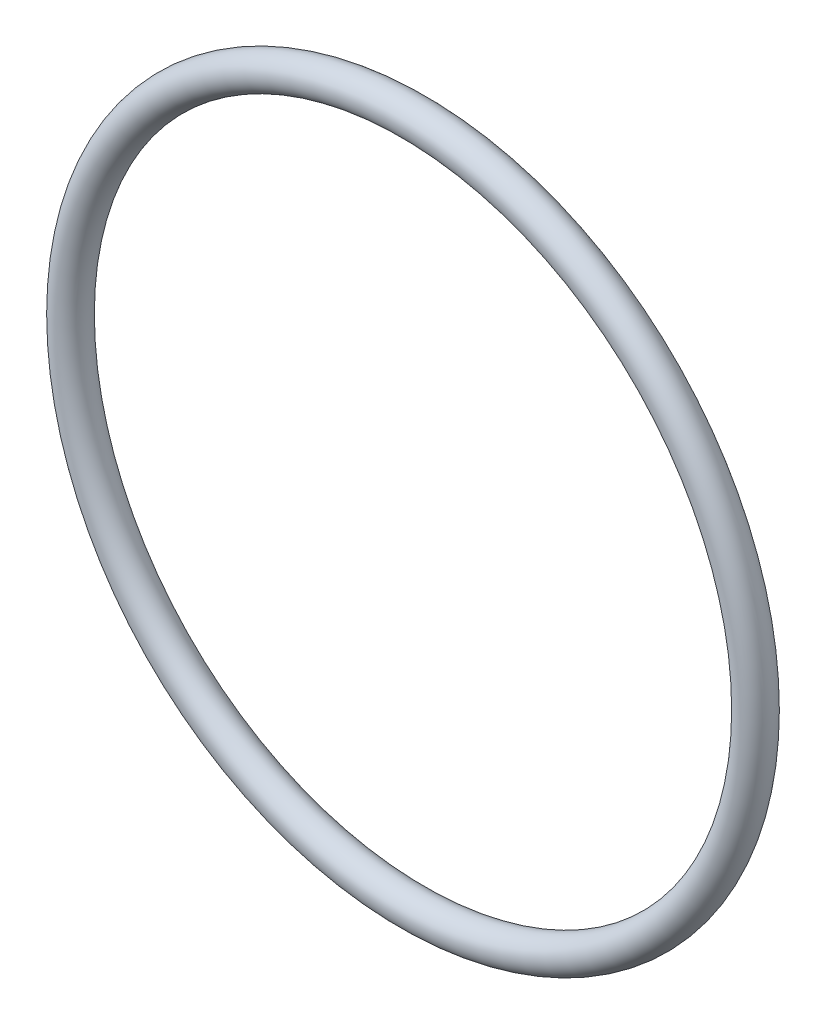
ISO-10303-21;
HEADER;
FILE_DESCRIPTION(('STEP AP214'),'2;1');
FILE_NAME('part.step','',(''),(''),'','','');
FILE_SCHEMA(('AUTOMOTIVE_DESIGN { 1 0 10303 214 1 1 1 1 }'));
ENDSEC;
DATA;
#1=APPLICATION_CONTEXT('core data for automotive mechanical design processes');
#2=APPLICATION_PROTOCOL_DEFINITION('international standard','automotive_design',2000,#1);
#3=PRODUCT_CONTEXT('',#1,'mechanical');
#4=PRODUCT('Part','Part','',(#3));
#5=PRODUCT_RELATED_PRODUCT_CATEGORY('part','',(#4));
#6=PRODUCT_DEFINITION_FORMATION('','',#4);
#7=PRODUCT_DEFINITION_CONTEXT('part definition',#1,'design');
#8=PRODUCT_DEFINITION('design','',#6,#7);
#9=PRODUCT_DEFINITION_SHAPE('','',#8);
#10=(LENGTH_UNIT() NAMED_UNIT(*) SI_UNIT(.MILLI.,.METRE.));
#11=(NAMED_UNIT(*) PLANE_ANGLE_UNIT() SI_UNIT($,.RADIAN.));
#12=(NAMED_UNIT(*) SI_UNIT($,.STERADIAN.) SOLID_ANGLE_UNIT());
#13=UNCERTAINTY_MEASURE_WITH_UNIT(LENGTH_MEASURE(1.E-05),#10,'distance_accuracy_value','');
#14=(GEOMETRIC_REPRESENTATION_CONTEXT(3) GLOBAL_UNCERTAINTY_ASSIGNED_CONTEXT((#13)) GLOBAL_UNIT_ASSIGNED_CONTEXT((#10,
#11,#12)) REPRESENTATION_CONTEXT('',''));
#15=CARTESIAN_POINT('',(0.,0.,0.));
#16=DIRECTION('',(0.,0.,1.));
#17=DIRECTION('',(1.,0.,0.));
#18=AXIS2_PLACEMENT_3D('',#15,#16,#17);
#19=CARTESIAN_POINT('',(0.,0.,0.));
#20=DIRECTION('',(0.,0.,1.));
#21=DIRECTION('',(1.,0.,0.));
#22=AXIS2_PLACEMENT_3D('',#19,#20,#21);
#23=TOROIDAL_SURFACE('',#22,26.543,1.30809999999999);
#24=CARTESIAN_POINT('',(27.8511,0.,0.));
#25=VERTEX_POINT('',#24);
#26=VERTEX_LOOP('',#25);
#27=FACE_BOUND('',#26,.T.);
#28=ADVANCED_FACE('F39',(#27),#23,.T.);
#29=CLOSED_SHELL('',(#28));
#30=MANIFOLD_SOLID_BREP('B2',#29);
#31=ADVANCED_BREP_SHAPE_REPRESENTATION('',(#18,#30),#14);
#32=SHAPE_DEFINITION_REPRESENTATION(#9,#31);
ENDSEC;
END-ISO-10303-21;
